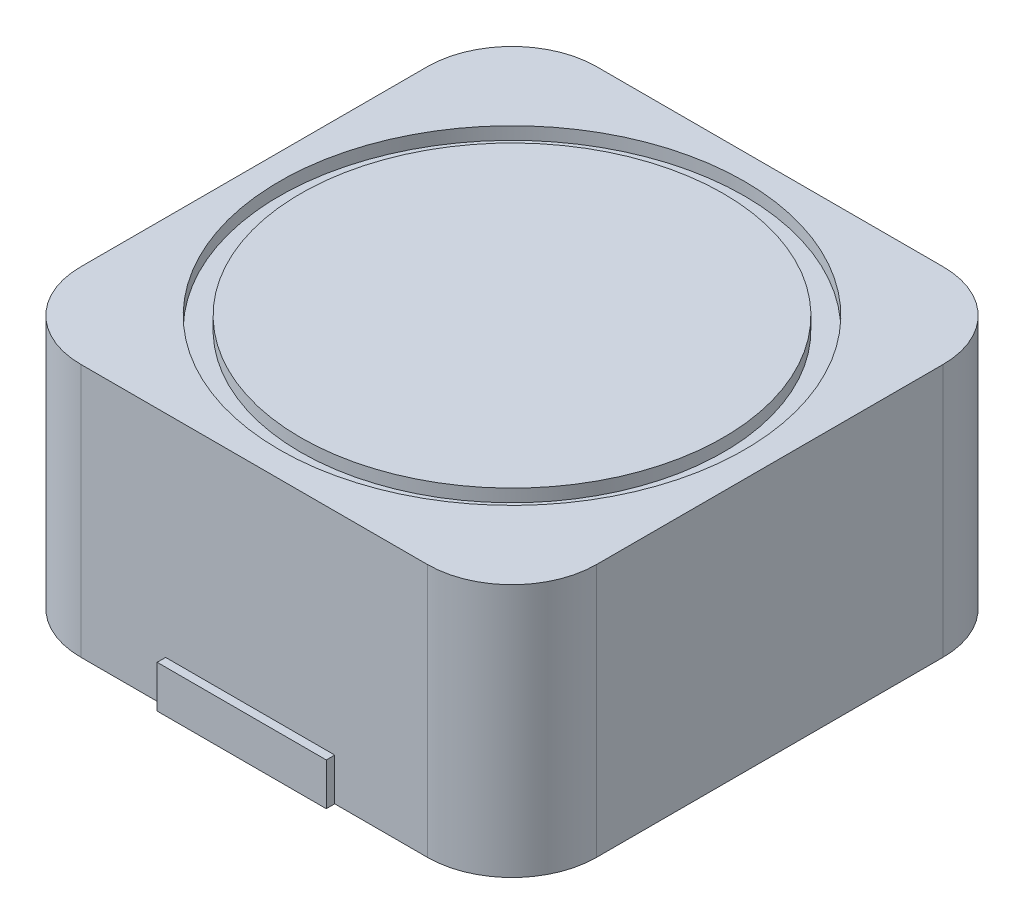
ISO-10303-21;
HEADER;
FILE_DESCRIPTION(('STEP AP214'),'2;1');
FILE_NAME('part.step','',(''),(''),'','','');
FILE_SCHEMA(('AUTOMOTIVE_DESIGN { 1 0 10303 214 1 1 1 1 }'));
ENDSEC;
DATA;
#1=APPLICATION_CONTEXT('core data for automotive mechanical design processes');
#2=APPLICATION_PROTOCOL_DEFINITION('international standard','automotive_design',2000,#1);
#3=PRODUCT_CONTEXT('',#1,'mechanical');
#4=PRODUCT('Part','Part','',(#3));
#5=PRODUCT_RELATED_PRODUCT_CATEGORY('part','',(#4));
#6=PRODUCT_DEFINITION_FORMATION('','',#4);
#7=PRODUCT_DEFINITION_CONTEXT('part definition',#1,'design');
#8=PRODUCT_DEFINITION('design','',#6,#7);
#9=PRODUCT_DEFINITION_SHAPE('','',#8);
#10=(LENGTH_UNIT() NAMED_UNIT(*) SI_UNIT(.MILLI.,.METRE.));
#11=(NAMED_UNIT(*) PLANE_ANGLE_UNIT() SI_UNIT($,.RADIAN.));
#12=(NAMED_UNIT(*) SI_UNIT($,.STERADIAN.) SOLID_ANGLE_UNIT());
#13=UNCERTAINTY_MEASURE_WITH_UNIT(LENGTH_MEASURE(1.E-05),#10,'distance_accuracy_value','');
#14=(GEOMETRIC_REPRESENTATION_CONTEXT(3) GLOBAL_UNCERTAINTY_ASSIGNED_CONTEXT((#13)) GLOBAL_UNIT_ASSIGNED_CONTEXT((#10,
#11,#12)) REPRESENTATION_CONTEXT('',''));
#15=CARTESIAN_POINT('',(0.,0.,0.));
#16=DIRECTION('',(0.,0.,1.));
#17=DIRECTION('',(1.,0.,0.));
#18=AXIS2_PLACEMENT_3D('',#15,#16,#17);
#19=CARTESIAN_POINT('',(0.,0.,-12.2));
#20=DIRECTION('',(0.,0.,-1.));
#21=DIRECTION('',(-1.,0.,0.));
#22=AXIS2_PLACEMENT_3D('',#19,#20,#21);
#23=PLANE('',#22);
#24=DIRECTION('',(-1.,0.,0.));
#25=VECTOR('',#24,1.);
#26=CARTESIAN_POINT('',(8.1,0.,-12.2));
#27=LINE('',#26,#25);
#28=CARTESIAN_POINT('',(4.1,0.,-12.2));
#29=VERTEX_POINT('',#28);
#30=CARTESIAN_POINT('',(8.1,0.,-12.2));
#31=VERTEX_POINT('',#30);
#32=EDGE_CURVE('P0_E81',#29,#31,#27,.F.);
#33=ORIENTED_EDGE('',*,*,#32,.T.);
#34=DIRECTION('',(0.,1.,0.));
#35=VECTOR('',#34,1.);
#36=CARTESIAN_POINT('',(8.1,1.,-12.2));
#37=LINE('',#36,#35);
#38=CARTESIAN_POINT('',(8.1,1.,-12.2));
#39=VERTEX_POINT('',#38);
#40=EDGE_CURVE('P0_E68',#31,#39,#37,.T.);
#41=ORIENTED_EDGE('',*,*,#40,.T.);
#42=DIRECTION('',(1.,0.,0.));
#43=VECTOR('',#42,1.);
#44=CARTESIAN_POINT('',(8.1,1.,-12.2));
#45=LINE('',#44,#43);
#46=CARTESIAN_POINT('',(4.1,1.,-12.2));
#47=VERTEX_POINT('',#46);
#48=EDGE_CURVE('P0_E55',#39,#47,#45,.F.);
#49=ORIENTED_EDGE('',*,*,#48,.T.);
#50=DIRECTION('',(0.,1.,0.));
#51=VECTOR('',#50,1.);
#52=CARTESIAN_POINT('',(4.1,1.,-12.2));
#53=LINE('',#52,#51);
#54=EDGE_CURVE('P0_E20',#47,#29,#53,.F.);
#55=ORIENTED_EDGE('',*,*,#54,.T.);
#56=EDGE_LOOP('',(#33,#41,#49,#55));
#57=FACE_BOUND('',#56,.T.);
#58=ADVANCED_FACE('P0_F17',(#57),#23,.F.);
#59=CARTESIAN_POINT('',(4.1,1.,-12.4));
#60=DIRECTION('',(1.,0.,0.));
#61=DIRECTION('',(0.,0.,-1.));
#62=AXIS2_PLACEMENT_3D('',#59,#60,#61);
#63=PLANE('',#62);
#64=DIRECTION('',(0.,0.,-1.));
#65=VECTOR('',#64,1.);
#66=CARTESIAN_POINT('',(4.1,1.,-12.4));
#67=LINE('',#66,#65);
#68=CARTESIAN_POINT('',(4.1,1.,-12.4));
#69=VERTEX_POINT('',#68);
#70=EDGE_CURVE('P0_E61',#47,#69,#67,.T.);
#71=ORIENTED_EDGE('',*,*,#70,.T.);
#72=DIRECTION('',(0.,1.,0.));
#73=VECTOR('',#72,1.);
#74=CARTESIAN_POINT('',(4.1,0.,-12.4));
#75=LINE('',#74,#73);
#76=CARTESIAN_POINT('',(4.1,0.,-12.4));
#77=VERTEX_POINT('',#76);
#78=EDGE_CURVE('P0_E83',#77,#69,#75,.T.);
#79=ORIENTED_EDGE('',*,*,#78,.F.);
#80=DIRECTION('',(0.,0.,1.));
#81=VECTOR('',#80,1.);
#82=CARTESIAN_POINT('',(4.1,0.,-12.4));
#83=LINE('',#82,#81);
#84=EDGE_CURVE('P0_E64',#77,#29,#83,.T.);
#85=ORIENTED_EDGE('',*,*,#84,.T.);
#86=ORIENTED_EDGE('',*,*,#54,.F.);
#87=EDGE_LOOP('',(#71,#79,#85,#86));
#88=FACE_BOUND('',#87,.T.);
#89=ADVANCED_FACE('P0_F60',(#88),#63,.F.);
#90=CARTESIAN_POINT('',(8.1,1.,-12.4));
#91=DIRECTION('',(0.,-1.,0.));
#92=DIRECTION('',(0.,0.,-1.));
#93=AXIS2_PLACEMENT_3D('',#90,#91,#92);
#94=PLANE('',#93);
#95=DIRECTION('',(0.,0.,1.));
#96=VECTOR('',#95,1.);
#97=CARTESIAN_POINT('',(8.1,1.,-12.4));
#98=LINE('',#97,#96);
#99=CARTESIAN_POINT('',(8.1,1.,-12.4));
#100=VERTEX_POINT('',#99);
#101=EDGE_CURVE('P0_E70',#39,#100,#98,.F.);
#102=ORIENTED_EDGE('',*,*,#101,.T.);
#103=DIRECTION('',(-1.,0.,0.));
#104=VECTOR('',#103,1.);
#105=CARTESIAN_POINT('',(0.,1.,-12.4));
#106=LINE('',#105,#104);
#107=EDGE_CURVE('P0_E74',#69,#100,#106,.F.);
#108=ORIENTED_EDGE('',*,*,#107,.F.);
#109=ORIENTED_EDGE('',*,*,#70,.F.);
#110=ORIENTED_EDGE('',*,*,#48,.F.);
#111=EDGE_LOOP('',(#102,#108,#109,#110));
#112=FACE_BOUND('',#111,.T.);
#113=ADVANCED_FACE('P0_F72',(#112),#94,.F.);
#114=CARTESIAN_POINT('',(8.1,1.,-12.4));
#115=DIRECTION('',(-1.,0.,0.));
#116=DIRECTION('',(0.,0.,1.));
#117=AXIS2_PLACEMENT_3D('',#114,#115,#116);
#118=PLANE('',#117);
#119=DIRECTION('',(0.,0.,1.));
#120=VECTOR('',#119,1.);
#121=CARTESIAN_POINT('',(8.1,0.,-12.4));
#122=LINE('',#121,#120);
#123=CARTESIAN_POINT('',(8.1,0.,-12.4));
#124=VERTEX_POINT('',#123);
#125=EDGE_CURVE('P0_E35',#31,#124,#122,.F.);
#126=ORIENTED_EDGE('',*,*,#125,.T.);
#127=DIRECTION('',(0.,1.,0.));
#128=VECTOR('',#127,1.);
#129=CARTESIAN_POINT('',(8.1,0.,-12.4));
#130=LINE('',#129,#128);
#131=EDGE_CURVE('P0_E26',#100,#124,#130,.F.);
#132=ORIENTED_EDGE('',*,*,#131,.F.);
#133=ORIENTED_EDGE('',*,*,#101,.F.);
#134=ORIENTED_EDGE('',*,*,#40,.F.);
#135=EDGE_LOOP('',(#126,#132,#133,#134));
#136=FACE_BOUND('',#135,.T.);
#137=ADVANCED_FACE('P0_F89',(#136),#118,.F.);
#138=CARTESIAN_POINT('',(8.1,0.,-12.4));
#139=DIRECTION('',(0.,1.,0.));
#140=DIRECTION('',(-1.,0.,0.));
#141=AXIS2_PLACEMENT_3D('',#138,#139,#140);
#142=PLANE('',#141);
#143=ORIENTED_EDGE('',*,*,#84,.F.);
#144=DIRECTION('',(-1.,0.,0.));
#145=VECTOR('',#144,1.);
#146=CARTESIAN_POINT('',(0.,0.,-12.4));
#147=LINE('',#146,#145);
#148=EDGE_CURVE('P0_E11',#124,#77,#147,.T.);
#149=ORIENTED_EDGE('',*,*,#148,.F.);
#150=ORIENTED_EDGE('',*,*,#125,.F.);
#151=ORIENTED_EDGE('',*,*,#32,.F.);
#152=EDGE_LOOP('',(#143,#149,#150,#151));
#153=FACE_BOUND('',#152,.T.);
#154=ADVANCED_FACE('P0_F91',(#153),#142,.F.);
#155=CARTESIAN_POINT('',(0.,0.,-12.4));
#156=DIRECTION('',(0.,0.,-1.));
#157=DIRECTION('',(-1.,0.,0.));
#158=AXIS2_PLACEMENT_3D('',#155,#156,#157);
#159=PLANE('',#158);
#160=ORIENTED_EDGE('',*,*,#131,.T.);
#161=ORIENTED_EDGE('',*,*,#148,.T.);
#162=ORIENTED_EDGE('',*,*,#78,.T.);
#163=ORIENTED_EDGE('',*,*,#107,.T.);
#164=EDGE_LOOP('',(#160,#161,#162,#163));
#165=FACE_BOUND('',#164,.T.);
#166=ADVANCED_FACE('P0_F88',(#165),#159,.T.);
#167=CLOSED_SHELL('',(#58,#89,#113,#137,#154,#166));
#168=MANIFOLD_SOLID_BREP('P0_B1',#167);
#169=CARTESIAN_POINT('',(0.,6.,0.));
#170=DIRECTION('',(0.,-1.,0.));
#171=DIRECTION('',(0.,0.,-1.));
#172=AXIS2_PLACEMENT_3D('',#169,#170,#171);
#173=PLANE('',#172);
#174=CARTESIAN_POINT('',(6.1,6.,-6.1));
#175=DIRECTION('',(0.,1.,0.));
#176=DIRECTION('',(0.,0.,1.));
#177=AXIS2_PLACEMENT_3D('',#174,#175,#176);
#178=CIRCLE('',#177,5.);
#179=CARTESIAN_POINT('',(6.1,6.,-1.1));
#180=VERTEX_POINT('',#179);
#181=EDGE_CURVE('P1_E20',#180,#180,#178,.F.);
#182=ORIENTED_EDGE('',*,*,#181,.F.);
#183=EDGE_LOOP('',(#182));
#184=FACE_BOUND('',#183,.T.);
#185=ADVANCED_FACE('P1_F17',(#184),#173,.F.);
#186=CARTESIAN_POINT('',(6.1,5.7,-6.1));
#187=DIRECTION('',(0.,1.,0.));
#188=DIRECTION('',(0.,0.,1.));
#189=AXIS2_PLACEMENT_3D('',#186,#187,#188);
#190=CYLINDRICAL_SURFACE('',#189,5.);
#191=CARTESIAN_POINT('',(6.1,5.7,-6.1));
#192=DIRECTION('',(0.,1.,0.));
#193=DIRECTION('',(0.,0.,1.));
#194=AXIS2_PLACEMENT_3D('',#191,#192,#193);
#195=CIRCLE('',#194,5.);
#196=CARTESIAN_POINT('',(6.1,5.7,-1.1));
#197=VERTEX_POINT('',#196);
#198=EDGE_CURVE('P1_E142',#197,#197,#195,.F.);
#199=ORIENTED_EDGE('',*,*,#198,.F.);
#200=EDGE_LOOP('',(#199));
#201=FACE_BOUND('',#200,.T.);
#202=ORIENTED_EDGE('',*,*,#181,.T.);
#203=EDGE_LOOP('',(#202));
#204=FACE_BOUND('',#203,.T.);
#205=ADVANCED_FACE('P1_F149',(#201,#204),#190,.T.);
#206=CARTESIAN_POINT('',(6.1,5.7,-6.1));
#207=DIRECTION('',(0.,1.,0.));
#208=DIRECTION('',(0.,0.,1.));
#209=AXIS2_PLACEMENT_3D('',#206,#207,#208);
#210=PLANE('',#209);
#211=CARTESIAN_POINT('',(6.1,5.7,-6.1));
#212=DIRECTION('',(0.,1.,0.));
#213=DIRECTION('',(0.,0.,1.));
#214=AXIS2_PLACEMENT_3D('',#211,#212,#213);
#215=CIRCLE('',#214,5.5);
#216=CARTESIAN_POINT('',(6.1,5.7,-0.6));
#217=VERTEX_POINT('',#216);
#218=EDGE_CURVE('P1_E140',#217,#217,#215,.T.);
#219=ORIENTED_EDGE('',*,*,#218,.T.);
#220=EDGE_LOOP('',(#219));
#221=FACE_BOUND('',#220,.T.);
#222=ORIENTED_EDGE('',*,*,#198,.T.);
#223=EDGE_LOOP('',(#222));
#224=FACE_BOUND('',#223,.T.);
#225=ADVANCED_FACE('P1_F156',(#221,#224),#210,.T.);
#226=CARTESIAN_POINT('',(6.1,5.7,-6.1));
#227=DIRECTION('',(0.,1.,0.));
#228=DIRECTION('',(0.,0.,1.));
#229=AXIS2_PLACEMENT_3D('',#226,#227,#228);
#230=CYLINDRICAL_SURFACE('',#229,5.5);
#231=ORIENTED_EDGE('',*,*,#218,.F.);
#232=EDGE_LOOP('',(#231));
#233=FACE_BOUND('',#232,.T.);
#234=CARTESIAN_POINT('',(6.1,6.,-6.1));
#235=DIRECTION('',(0.,1.,0.));
#236=DIRECTION('',(0.,0.,1.));
#237=AXIS2_PLACEMENT_3D('',#234,#235,#236);
#238=CIRCLE('',#237,5.5);
#239=CARTESIAN_POINT('',(6.1,6.,-0.6));
#240=VERTEX_POINT('',#239);
#241=EDGE_CURVE('P1_E118',#240,#240,#238,.T.);
#242=ORIENTED_EDGE('',*,*,#241,.T.);
#243=EDGE_LOOP('',(#242));
#244=FACE_BOUND('',#243,.T.);
#245=ADVANCED_FACE('P1_F195',(#233,#244),#230,.F.);
#246=CARTESIAN_POINT('',(0.,6.,0.));
#247=DIRECTION('',(0.,-1.,0.));
#248=DIRECTION('',(0.,0.,-1.));
#249=AXIS2_PLACEMENT_3D('',#246,#247,#248);
#250=PLANE('',#249);
#251=CARTESIAN_POINT('',(10.2,6.,-10.2));
#252=DIRECTION('',(0.,-1.,0.));
#253=DIRECTION('',(0.,0.,-1.));
#254=AXIS2_PLACEMENT_3D('',#251,#252,#253);
#255=CIRCLE('',#254,2.);
#256=CARTESIAN_POINT('',(10.2,6.,-12.2));
#257=VERTEX_POINT('',#256);
#258=CARTESIAN_POINT('',(12.2,6.,-10.2));
#259=VERTEX_POINT('',#258);
#260=EDGE_CURVE('P1_E80',#257,#259,#255,.T.);
#261=ORIENTED_EDGE('',*,*,#260,.F.);
#262=DIRECTION('',(1.,0.,0.));
#263=VECTOR('',#262,1.);
#264=CARTESIAN_POINT('',(0.,6.,-12.2));
#265=LINE('',#264,#263);
#266=CARTESIAN_POINT('',(2.,6.,-12.2));
#267=VERTEX_POINT('',#266);
#268=EDGE_CURVE('P1_E99',#257,#267,#265,.F.);
#269=ORIENTED_EDGE('',*,*,#268,.T.);
#270=CARTESIAN_POINT('',(2.,6.,-10.2));
#271=DIRECTION('',(0.,-1.,0.));
#272=DIRECTION('',(0.,0.,-1.));
#273=AXIS2_PLACEMENT_3D('',#270,#271,#272);
#274=CIRCLE('',#273,2.);
#275=CARTESIAN_POINT('',(0.,6.,-10.2));
#276=VERTEX_POINT('',#275);
#277=EDGE_CURVE('P1_E115',#276,#267,#274,.T.);
#278=ORIENTED_EDGE('',*,*,#277,.F.);
#279=DIRECTION('',(0.,0.,-1.));
#280=VECTOR('',#279,1.);
#281=CARTESIAN_POINT('',(0.,6.,0.));
#282=LINE('',#281,#280);
#283=CARTESIAN_POINT('',(0.,6.,-2.));
#284=VERTEX_POINT('',#283);
#285=EDGE_CURVE('P1_E112',#276,#284,#282,.F.);
#286=ORIENTED_EDGE('',*,*,#285,.T.);
#287=CARTESIAN_POINT('',(2.,6.,-2.));
#288=DIRECTION('',(0.,-1.,0.));
#289=DIRECTION('',(0.,0.,-1.));
#290=AXIS2_PLACEMENT_3D('',#287,#288,#289);
#291=CIRCLE('',#290,2.);
#292=CARTESIAN_POINT('',(2.,6.,0.));
#293=VERTEX_POINT('',#292);
#294=EDGE_CURVE('P1_E120',#293,#284,#291,.T.);
#295=ORIENTED_EDGE('',*,*,#294,.F.);
#296=DIRECTION('',(-1.,0.,0.));
#297=VECTOR('',#296,1.);
#298=CARTESIAN_POINT('',(0.,6.,0.));
#299=LINE('',#298,#297);
#300=CARTESIAN_POINT('',(10.2,6.,0.));
#301=VERTEX_POINT('',#300);
#302=EDGE_CURVE('P1_E119',#293,#301,#299,.F.);
#303=ORIENTED_EDGE('',*,*,#302,.T.);
#304=CARTESIAN_POINT('',(10.2,6.,-2.));
#305=DIRECTION('',(0.,-1.,0.));
#306=DIRECTION('',(0.,0.,-1.));
#307=AXIS2_PLACEMENT_3D('',#304,#305,#306);
#308=CIRCLE('',#307,2.);
#309=CARTESIAN_POINT('',(12.2,6.,-2.));
#310=VERTEX_POINT('',#309);
#311=EDGE_CURVE('P1_E87',#310,#301,#308,.T.);
#312=ORIENTED_EDGE('',*,*,#311,.F.);
#313=DIRECTION('',(0.,0.,1.));
#314=VECTOR('',#313,1.);
#315=CARTESIAN_POINT('',(12.2,6.,0.));
#316=LINE('',#315,#314);
#317=EDGE_CURVE('P1_E83',#310,#259,#316,.F.);
#318=ORIENTED_EDGE('',*,*,#317,.T.);
#319=EDGE_LOOP('',(#261,#269,#278,#286,#295,#303,#312,#318));
#320=FACE_BOUND('',#319,.T.);
#321=ORIENTED_EDGE('',*,*,#241,.F.);
#322=EDGE_LOOP('',(#321));
#323=FACE_BOUND('',#322,.T.);
#324=ADVANCED_FACE('P1_F84',(#320,#323),#250,.F.);
#325=CARTESIAN_POINT('',(0.,6.,-12.2));
#326=DIRECTION('',(0.,0.,1.));
#327=DIRECTION('',(1.,0.,0.));
#328=AXIS2_PLACEMENT_3D('',#325,#326,#327);
#329=PLANE('',#328);
#330=DIRECTION('',(0.,-1.,0.));
#331=VECTOR('',#330,1.);
#332=CARTESIAN_POINT('',(10.2,6.,-12.2));
#333=LINE('',#332,#331);
#334=CARTESIAN_POINT('',(10.2,0.,-12.2));
#335=VERTEX_POINT('',#334);
#336=EDGE_CURVE('P1_E92',#335,#257,#333,.F.);
#337=ORIENTED_EDGE('',*,*,#336,.F.);
#338=DIRECTION('',(1.,0.,0.));
#339=VECTOR('',#338,1.);
#340=CARTESIAN_POINT('',(0.,0.,-12.2));
#341=LINE('',#340,#339);
#342=CARTESIAN_POINT('',(2.,0.,-12.2));
#343=VERTEX_POINT('',#342);
#344=EDGE_CURVE('P1_E132',#343,#335,#341,.T.);
#345=ORIENTED_EDGE('',*,*,#344,.F.);
#346=DIRECTION('',(0.,-1.,0.));
#347=VECTOR('',#346,1.);
#348=CARTESIAN_POINT('',(2.,6.,-12.2));
#349=LINE('',#348,#347);
#350=EDGE_CURVE('P1_E135',#267,#343,#349,.T.);
#351=ORIENTED_EDGE('',*,*,#350,.F.);
#352=ORIENTED_EDGE('',*,*,#268,.F.);
#353=EDGE_LOOP('',(#337,#345,#351,#352));
#354=FACE_BOUND('',#353,.T.);
#355=ADVANCED_FACE('P1_F189',(#354),#329,.F.);
#356=CARTESIAN_POINT('',(10.2,6.,-10.2));
#357=DIRECTION('',(0.,-1.,0.));
#358=DIRECTION('',(0.,0.,-1.));
#359=AXIS2_PLACEMENT_3D('',#356,#357,#358);
#360=CYLINDRICAL_SURFACE('',#359,2.);
#361=CARTESIAN_POINT('',(10.2,0.,-10.2));
#362=DIRECTION('',(0.,-1.,0.));
#363=DIRECTION('',(0.,0.,-1.));
#364=AXIS2_PLACEMENT_3D('',#361,#362,#363);
#365=CIRCLE('',#364,2.);
#366=CARTESIAN_POINT('',(12.2,0.,-10.2));
#367=VERTEX_POINT('',#366);
#368=EDGE_CURVE('P1_E130',#335,#367,#365,.T.);
#369=ORIENTED_EDGE('',*,*,#368,.F.);
#370=ORIENTED_EDGE('',*,*,#336,.T.);
#371=ORIENTED_EDGE('',*,*,#260,.T.);
#372=DIRECTION('',(0.,1.,0.));
#373=VECTOR('',#372,1.);
#374=CARTESIAN_POINT('',(12.2,6.,-10.2));
#375=LINE('',#374,#373);
#376=EDGE_CURVE('P1_E91',#259,#367,#375,.F.);
#377=ORIENTED_EDGE('',*,*,#376,.T.);
#378=EDGE_LOOP('',(#369,#370,#371,#377));
#379=FACE_BOUND('',#378,.T.);
#380=ADVANCED_FACE('P1_F97',(#379),#360,.T.);
#381=CARTESIAN_POINT('',(12.2,6.,0.));
#382=DIRECTION('',(-1.,0.,0.));
#383=DIRECTION('',(0.,0.,1.));
#384=AXIS2_PLACEMENT_3D('',#381,#382,#383);
#385=PLANE('',#384);
#386=ORIENTED_EDGE('',*,*,#376,.F.);
#387=ORIENTED_EDGE('',*,*,#317,.F.);
#388=DIRECTION('',(0.,-1.,0.));
#389=VECTOR('',#388,1.);
#390=CARTESIAN_POINT('',(12.2,6.,-2.));
#391=LINE('',#390,#389);
#392=CARTESIAN_POINT('',(12.2,0.,-2.));
#393=VERTEX_POINT('',#392);
#394=EDGE_CURVE('P1_E106',#393,#310,#391,.F.);
#395=ORIENTED_EDGE('',*,*,#394,.F.);
#396=DIRECTION('',(0.,0.,-1.));
#397=VECTOR('',#396,1.);
#398=CARTESIAN_POINT('',(12.2,0.,0.));
#399=LINE('',#398,#397);
#400=EDGE_CURVE('P1_E103',#367,#393,#399,.F.);
#401=ORIENTED_EDGE('',*,*,#400,.F.);
#402=EDGE_LOOP('',(#386,#387,#395,#401));
#403=FACE_BOUND('',#402,.T.);
#404=ADVANCED_FACE('P1_F101',(#403),#385,.F.);
#405=CARTESIAN_POINT('',(10.2,6.,-2.));
#406=DIRECTION('',(0.,-1.,0.));
#407=DIRECTION('',(0.,0.,-1.));
#408=AXIS2_PLACEMENT_3D('',#405,#406,#407);
#409=CYLINDRICAL_SURFACE('',#408,2.);
#410=CARTESIAN_POINT('',(10.2,0.,-2.));
#411=DIRECTION('',(0.,-1.,0.));
#412=DIRECTION('',(0.,0.,-1.));
#413=AXIS2_PLACEMENT_3D('',#410,#411,#412);
#414=CIRCLE('',#413,2.);
#415=CARTESIAN_POINT('',(10.2,0.,0.));
#416=VERTEX_POINT('',#415);
#417=EDGE_CURVE('P1_E127',#393,#416,#414,.T.);
#418=ORIENTED_EDGE('',*,*,#417,.F.);
#419=ORIENTED_EDGE('',*,*,#394,.T.);
#420=ORIENTED_EDGE('',*,*,#311,.T.);
#421=DIRECTION('',(0.,1.,0.));
#422=VECTOR('',#421,1.);
#423=CARTESIAN_POINT('',(10.2,6.,0.));
#424=LINE('',#423,#422);
#425=EDGE_CURVE('P1_E121',#301,#416,#424,.F.);
#426=ORIENTED_EDGE('',*,*,#425,.T.);
#427=EDGE_LOOP('',(#418,#419,#420,#426));
#428=FACE_BOUND('',#427,.T.);
#429=ADVANCED_FACE('P1_F180',(#428),#409,.T.);
#430=CARTESIAN_POINT('',(0.,6.,0.));
#431=DIRECTION('',(0.,0.,-1.));
#432=DIRECTION('',(-1.,0.,0.));
#433=AXIS2_PLACEMENT_3D('',#430,#431,#432);
#434=PLANE('',#433);
#435=DIRECTION('',(0.,-1.,0.));
#436=VECTOR('',#435,1.);
#437=CARTESIAN_POINT('',(2.,6.,0.));
#438=LINE('',#437,#436);
#439=CARTESIAN_POINT('',(2.,0.,0.));
#440=VERTEX_POINT('',#439);
#441=EDGE_CURVE('P1_E136',#440,#293,#438,.F.);
#442=ORIENTED_EDGE('',*,*,#441,.F.);
#443=DIRECTION('',(1.,0.,0.));
#444=VECTOR('',#443,1.);
#445=CARTESIAN_POINT('',(0.,0.,0.));
#446=LINE('',#445,#444);
#447=EDGE_CURVE('P1_E126',#416,#440,#446,.F.);
#448=ORIENTED_EDGE('',*,*,#447,.F.);
#449=ORIENTED_EDGE('',*,*,#425,.F.);
#450=ORIENTED_EDGE('',*,*,#302,.F.);
#451=EDGE_LOOP('',(#442,#448,#449,#450));
#452=FACE_BOUND('',#451,.T.);
#453=ADVANCED_FACE('P1_F176',(#452),#434,.F.);
#454=CARTESIAN_POINT('',(2.,6.,-2.));
#455=DIRECTION('',(0.,-1.,0.));
#456=DIRECTION('',(0.,0.,-1.));
#457=AXIS2_PLACEMENT_3D('',#454,#455,#456);
#458=CYLINDRICAL_SURFACE('',#457,2.);
#459=CARTESIAN_POINT('',(2.,0.,-2.));
#460=DIRECTION('',(0.,-1.,0.));
#461=DIRECTION('',(0.,0.,-1.));
#462=AXIS2_PLACEMENT_3D('',#459,#460,#461);
#463=CIRCLE('',#462,2.);
#464=CARTESIAN_POINT('',(0.,0.,-2.));
#465=VERTEX_POINT('',#464);
#466=EDGE_CURVE('P1_E123',#440,#465,#463,.T.);
#467=ORIENTED_EDGE('',*,*,#466,.F.);
#468=ORIENTED_EDGE('',*,*,#441,.T.);
#469=ORIENTED_EDGE('',*,*,#294,.T.);
#470=DIRECTION('',(0.,1.,0.));
#471=VECTOR('',#470,1.);
#472=CARTESIAN_POINT('',(0.,6.,-2.));
#473=LINE('',#472,#471);
#474=EDGE_CURVE('P1_E116',#284,#465,#473,.F.);
#475=ORIENTED_EDGE('',*,*,#474,.T.);
#476=EDGE_LOOP('',(#467,#468,#469,#475));
#477=FACE_BOUND('',#476,.T.);
#478=ADVANCED_FACE('P1_F173',(#477),#458,.T.);
#479=CARTESIAN_POINT('',(0.,6.,0.));
#480=DIRECTION('',(1.,0.,0.));
#481=DIRECTION('',(0.,0.,-1.));
#482=AXIS2_PLACEMENT_3D('',#479,#480,#481);
#483=PLANE('',#482);
#484=DIRECTION('',(0.,-1.,0.));
#485=VECTOR('',#484,1.);
#486=CARTESIAN_POINT('',(0.,6.,-10.2));
#487=LINE('',#486,#485);
#488=CARTESIAN_POINT('',(0.,0.,-10.2));
#489=VERTEX_POINT('',#488);
#490=EDGE_CURVE('P1_E35',#489,#276,#487,.F.);
#491=ORIENTED_EDGE('',*,*,#490,.F.);
#492=DIRECTION('',(0.,0.,-1.));
#493=VECTOR('',#492,1.);
#494=CARTESIAN_POINT('',(0.,0.,0.));
#495=LINE('',#494,#493);
#496=EDGE_CURVE('P1_E26',#465,#489,#495,.T.);
#497=ORIENTED_EDGE('',*,*,#496,.F.);
#498=ORIENTED_EDGE('',*,*,#474,.F.);
#499=ORIENTED_EDGE('',*,*,#285,.F.);
#500=EDGE_LOOP('',(#491,#497,#498,#499));
#501=FACE_BOUND('',#500,.T.);
#502=ADVANCED_FACE('P1_F166',(#501),#483,.F.);
#503=CARTESIAN_POINT('',(2.,6.,-10.2));
#504=DIRECTION('',(0.,-1.,0.));
#505=DIRECTION('',(0.,0.,-1.));
#506=AXIS2_PLACEMENT_3D('',#503,#504,#505);
#507=CYLINDRICAL_SURFACE('',#506,2.);
#508=CARTESIAN_POINT('',(2.,0.,-10.2));
#509=DIRECTION('',(0.,-1.,0.));
#510=DIRECTION('',(0.,0.,-1.));
#511=AXIS2_PLACEMENT_3D('',#508,#509,#510);
#512=CIRCLE('',#511,2.);
#513=EDGE_CURVE('P1_E11',#489,#343,#512,.T.);
#514=ORIENTED_EDGE('',*,*,#513,.F.);
#515=ORIENTED_EDGE('',*,*,#490,.T.);
#516=ORIENTED_EDGE('',*,*,#277,.T.);
#517=ORIENTED_EDGE('',*,*,#350,.T.);
#518=EDGE_LOOP('',(#514,#515,#516,#517));
#519=FACE_BOUND('',#518,.T.);
#520=ADVANCED_FACE('P1_F160',(#519),#507,.T.);
#521=CARTESIAN_POINT('',(0.,0.,0.));
#522=DIRECTION('',(0.,-1.,0.));
#523=DIRECTION('',(0.,0.,-1.));
#524=AXIS2_PLACEMENT_3D('',#521,#522,#523);
#525=PLANE('',#524);
#526=ORIENTED_EDGE('',*,*,#496,.T.);
#527=ORIENTED_EDGE('',*,*,#513,.T.);
#528=ORIENTED_EDGE('',*,*,#344,.T.);
#529=ORIENTED_EDGE('',*,*,#368,.T.);
#530=ORIENTED_EDGE('',*,*,#400,.T.);
#531=ORIENTED_EDGE('',*,*,#417,.T.);
#532=ORIENTED_EDGE('',*,*,#447,.T.);
#533=ORIENTED_EDGE('',*,*,#466,.T.);
#534=EDGE_LOOP('',(#526,#527,#528,#529,#530,#531,#532,#533));
#535=FACE_BOUND('',#534,.T.);
#536=ADVANCED_FACE('P1_F158',(#535),#525,.T.);
#537=CLOSED_SHELL('',(#185,#205,#225,#245,#324,#355,#380,#404,#429,#453,#478,#502,#520,#536));
#538=MANIFOLD_SOLID_BREP('P1_B1',#537);
#539=CARTESIAN_POINT('',(0.,0.,0.));
#540=DIRECTION('',(0.,0.,1.));
#541=DIRECTION('',(1.,0.,0.));
#542=AXIS2_PLACEMENT_3D('',#539,#540,#541);
#543=PLANE('',#542);
#544=DIRECTION('',(1.,0.,0.));
#545=VECTOR('',#544,1.);
#546=CARTESIAN_POINT('',(8.006349402238,1.,0.));
#547=LINE('',#546,#545);
#548=CARTESIAN_POINT('',(4.006349402238,1.,0.));
#549=VERTEX_POINT('',#548);
#550=CARTESIAN_POINT('',(8.006349402238,1.,0.));
#551=VERTEX_POINT('',#550);
#552=EDGE_CURVE('P2_E81',#549,#551,#547,.T.);
#553=ORIENTED_EDGE('',*,*,#552,.T.);
#554=DIRECTION('',(0.,1.,0.));
#555=VECTOR('',#554,1.);
#556=CARTESIAN_POINT('',(8.006349402238,0.,0.));
#557=LINE('',#556,#555);
#558=CARTESIAN_POINT('',(8.006349402238,0.,0.));
#559=VERTEX_POINT('',#558);
#560=EDGE_CURVE('P2_E68',#551,#559,#557,.F.);
#561=ORIENTED_EDGE('',*,*,#560,.T.);
#562=DIRECTION('',(-1.,0.,0.));
#563=VECTOR('',#562,1.);
#564=CARTESIAN_POINT('',(8.006349402238,0.,0.));
#565=LINE('',#564,#563);
#566=CARTESIAN_POINT('',(4.006349402238,0.,0.));
#567=VERTEX_POINT('',#566);
#568=EDGE_CURVE('P2_E55',#559,#567,#565,.T.);
#569=ORIENTED_EDGE('',*,*,#568,.T.);
#570=DIRECTION('',(0.,1.,0.));
#571=VECTOR('',#570,1.);
#572=CARTESIAN_POINT('',(4.006349402238,0.,0.));
#573=LINE('',#572,#571);
#574=EDGE_CURVE('P2_E20',#567,#549,#573,.T.);
#575=ORIENTED_EDGE('',*,*,#574,.T.);
#576=EDGE_LOOP('',(#553,#561,#569,#575));
#577=FACE_BOUND('',#576,.T.);
#578=ADVANCED_FACE('P2_F17',(#577),#543,.F.);
#579=CARTESIAN_POINT('',(4.006349402238,0.,0.2));
#580=DIRECTION('',(1.,0.,0.));
#581=DIRECTION('',(0.,1.,0.));
#582=AXIS2_PLACEMENT_3D('',#579,#580,#581);
#583=PLANE('',#582);
#584=DIRECTION('',(0.,0.,1.));
#585=VECTOR('',#584,1.);
#586=CARTESIAN_POINT('',(4.006349402238,0.,0.2));
#587=LINE('',#586,#585);
#588=CARTESIAN_POINT('',(4.006349402238,0.,0.2));
#589=VERTEX_POINT('',#588);
#590=EDGE_CURVE('P2_E61',#567,#589,#587,.T.);
#591=ORIENTED_EDGE('',*,*,#590,.T.);
#592=DIRECTION('',(0.,1.,0.));
#593=VECTOR('',#592,1.);
#594=CARTESIAN_POINT('',(4.006349402238,0.,0.2));
#595=LINE('',#594,#593);
#596=CARTESIAN_POINT('',(4.006349402238,1.,0.2));
#597=VERTEX_POINT('',#596);
#598=EDGE_CURVE('P2_E83',#597,#589,#595,.F.);
#599=ORIENTED_EDGE('',*,*,#598,.F.);
#600=DIRECTION('',(0.,0.,1.));
#601=VECTOR('',#600,1.);
#602=CARTESIAN_POINT('',(4.006349402238,0.999999999999999,0.2));
#603=LINE('',#602,#601);
#604=EDGE_CURVE('P2_E64',#597,#549,#603,.F.);
#605=ORIENTED_EDGE('',*,*,#604,.T.);
#606=ORIENTED_EDGE('',*,*,#574,.F.);
#607=EDGE_LOOP('',(#591,#599,#605,#606));
#608=FACE_BOUND('',#607,.T.);
#609=ADVANCED_FACE('P2_F60',(#608),#583,.F.);
#610=CARTESIAN_POINT('',(8.006349402238,0.,0.2));
#611=DIRECTION('',(0.,1.,0.));
#612=DIRECTION('',(-1.,0.,0.));
#613=AXIS2_PLACEMENT_3D('',#610,#611,#612);
#614=PLANE('',#613);
#615=DIRECTION('',(0.,0.,1.));
#616=VECTOR('',#615,1.);
#617=CARTESIAN_POINT('',(8.006349402238,0.,0.2));
#618=LINE('',#617,#616);
#619=CARTESIAN_POINT('',(8.006349402238,0.,0.2));
#620=VERTEX_POINT('',#619);
#621=EDGE_CURVE('P2_E70',#559,#620,#618,.T.);
#622=ORIENTED_EDGE('',*,*,#621,.T.);
#623=DIRECTION('',(1.,0.,0.));
#624=VECTOR('',#623,1.);
#625=CARTESIAN_POINT('',(0.,0.,0.2));
#626=LINE('',#625,#624);
#627=EDGE_CURVE('P2_E74',#589,#620,#626,.T.);
#628=ORIENTED_EDGE('',*,*,#627,.F.);
#629=ORIENTED_EDGE('',*,*,#590,.F.);
#630=ORIENTED_EDGE('',*,*,#568,.F.);
#631=EDGE_LOOP('',(#622,#628,#629,#630));
#632=FACE_BOUND('',#631,.T.);
#633=ADVANCED_FACE('P2_F72',(#632),#614,.F.);
#634=CARTESIAN_POINT('',(8.006349402238,0.,0.2));
#635=DIRECTION('',(-1.,0.,0.));
#636=DIRECTION('',(0.,0.,1.));
#637=AXIS2_PLACEMENT_3D('',#634,#635,#636);
#638=PLANE('',#637);
#639=DIRECTION('',(0.,0.,1.));
#640=VECTOR('',#639,1.);
#641=CARTESIAN_POINT('',(8.006349402238,1.,0.2));
#642=LINE('',#641,#640);
#643=CARTESIAN_POINT('',(8.006349402238,1.,0.2));
#644=VERTEX_POINT('',#643);
#645=EDGE_CURVE('P2_E35',#551,#644,#642,.T.);
#646=ORIENTED_EDGE('',*,*,#645,.T.);
#647=DIRECTION('',(0.,1.,0.));
#648=VECTOR('',#647,1.);
#649=CARTESIAN_POINT('',(8.006349402238,0.,0.2));
#650=LINE('',#649,#648);
#651=EDGE_CURVE('P2_E26',#620,#644,#650,.T.);
#652=ORIENTED_EDGE('',*,*,#651,.F.);
#653=ORIENTED_EDGE('',*,*,#621,.F.);
#654=ORIENTED_EDGE('',*,*,#560,.F.);
#655=EDGE_LOOP('',(#646,#652,#653,#654));
#656=FACE_BOUND('',#655,.T.);
#657=ADVANCED_FACE('P2_F89',(#656),#638,.F.);
#658=CARTESIAN_POINT('',(8.006349402238,1.,0.2));
#659=DIRECTION('',(0.,-1.,0.));
#660=DIRECTION('',(1.,0.,0.));
#661=AXIS2_PLACEMENT_3D('',#658,#659,#660);
#662=PLANE('',#661);
#663=ORIENTED_EDGE('',*,*,#604,.F.);
#664=DIRECTION('',(1.,0.,0.));
#665=VECTOR('',#664,1.);
#666=CARTESIAN_POINT('',(0.,1.,0.2));
#667=LINE('',#666,#665);
#668=EDGE_CURVE('P2_E11',#644,#597,#667,.F.);
#669=ORIENTED_EDGE('',*,*,#668,.F.);
#670=ORIENTED_EDGE('',*,*,#645,.F.);
#671=ORIENTED_EDGE('',*,*,#552,.F.);
#672=EDGE_LOOP('',(#663,#669,#670,#671));
#673=FACE_BOUND('',#672,.T.);
#674=ADVANCED_FACE('P2_F91',(#673),#662,.F.);
#675=CARTESIAN_POINT('',(0.,0.,0.2));
#676=DIRECTION('',(0.,0.,1.));
#677=DIRECTION('',(1.,0.,0.));
#678=AXIS2_PLACEMENT_3D('',#675,#676,#677);
#679=PLANE('',#678);
#680=ORIENTED_EDGE('',*,*,#651,.T.);
#681=ORIENTED_EDGE('',*,*,#668,.T.);
#682=ORIENTED_EDGE('',*,*,#598,.T.);
#683=ORIENTED_EDGE('',*,*,#627,.T.);
#684=EDGE_LOOP('',(#680,#681,#682,#683));
#685=FACE_BOUND('',#684,.T.);
#686=ADVANCED_FACE('P2_F88',(#685),#679,.T.);
#687=CLOSED_SHELL('',(#578,#609,#633,#657,#674,#686));
#688=MANIFOLD_SOLID_BREP('P2_B1',#687);
#689=ADVANCED_BREP_SHAPE_REPRESENTATION('',(#18,#168,#538,#688),#14);
#690=SHAPE_DEFINITION_REPRESENTATION(#9,#689);
ENDSEC;
END-ISO-10303-21;
